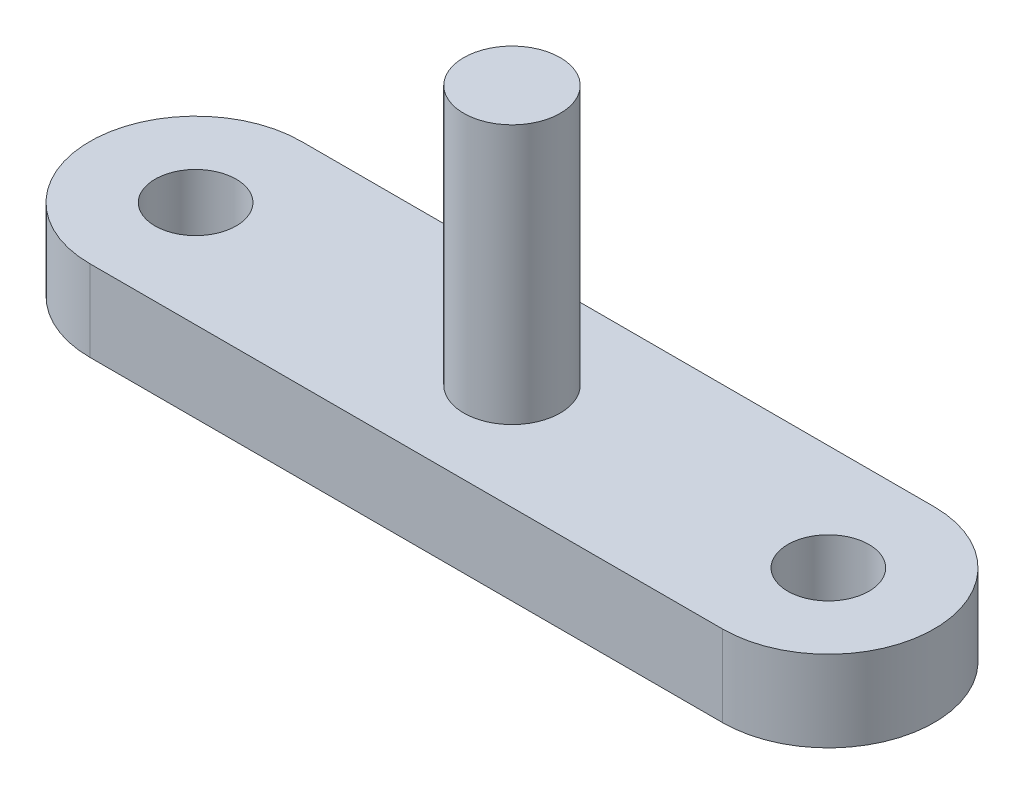
ISO-10303-21;
HEADER;
FILE_DESCRIPTION(('STEP AP214'),'2;1');
FILE_NAME('part.step','',(''),(''),'','','');
FILE_SCHEMA(('AUTOMOTIVE_DESIGN { 1 0 10303 214 1 1 1 1 }'));
ENDSEC;
DATA;
#1=APPLICATION_CONTEXT('core data for automotive mechanical design processes');
#2=APPLICATION_PROTOCOL_DEFINITION('international standard','automotive_design',2000,#1);
#3=PRODUCT_CONTEXT('',#1,'mechanical');
#4=PRODUCT('Part','Part','',(#3));
#5=PRODUCT_RELATED_PRODUCT_CATEGORY('part','',(#4));
#6=PRODUCT_DEFINITION_FORMATION('','',#4);
#7=PRODUCT_DEFINITION_CONTEXT('part definition',#1,'design');
#8=PRODUCT_DEFINITION('design','',#6,#7);
#9=PRODUCT_DEFINITION_SHAPE('','',#8);
#10=(LENGTH_UNIT() NAMED_UNIT(*) SI_UNIT(.MILLI.,.METRE.));
#11=(NAMED_UNIT(*) PLANE_ANGLE_UNIT() SI_UNIT($,.RADIAN.));
#12=(NAMED_UNIT(*) SI_UNIT($,.STERADIAN.) SOLID_ANGLE_UNIT());
#13=UNCERTAINTY_MEASURE_WITH_UNIT(LENGTH_MEASURE(1.E-05),#10,'distance_accuracy_value','');
#14=(GEOMETRIC_REPRESENTATION_CONTEXT(3) GLOBAL_UNCERTAINTY_ASSIGNED_CONTEXT((#13)) GLOBAL_UNIT_ASSIGNED_CONTEXT((#10,
#11,#12)) REPRESENTATION_CONTEXT('',''));
#15=CARTESIAN_POINT('',(0.,0.,0.));
#16=DIRECTION('',(0.,0.,1.));
#17=DIRECTION('',(1.,0.,0.));
#18=AXIS2_PLACEMENT_3D('',#15,#16,#17);
#19=CARTESIAN_POINT('',(0.,5.,6.52373761226954));
#20=DIRECTION('',(0.,0.,-1.));
#21=DIRECTION('',(-1.,0.,0.));
#22=AXIS2_PLACEMENT_3D('',#19,#20,#21);
#23=PLANE('',#22);
#24=DIRECTION('',(1.,0.,0.));
#25=VECTOR('',#24,1.);
#26=CARTESIAN_POINT('',(0.,0.,6.52373761226954));
#27=LINE('',#26,#25);
#28=CARTESIAN_POINT('',(-19.5,0.,6.52373761226954));
#29=VERTEX_POINT('',#28);
#30=CARTESIAN_POINT('',(19.5,0.,6.52373761226954));
#31=VERTEX_POINT('',#30);
#32=EDGE_CURVE('E114',#29,#31,#27,.T.);
#33=ORIENTED_EDGE('',*,*,#32,.T.);
#34=DIRECTION('',(0.,-1.,0.));
#35=VECTOR('',#34,1.);
#36=CARTESIAN_POINT('',(19.5,5.,6.52373761226954));
#37=LINE('',#36,#35);
#38=CARTESIAN_POINT('',(19.5,5.,6.52373761226954));
#39=VERTEX_POINT('',#38);
#40=EDGE_CURVE('E11',#39,#31,#37,.T.);
#41=ORIENTED_EDGE('',*,*,#40,.F.);
#42=DIRECTION('',(1.,0.,0.));
#43=VECTOR('',#42,1.);
#44=CARTESIAN_POINT('',(0.,5.,6.52373761226954));
#45=LINE('',#44,#43);
#46=CARTESIAN_POINT('',(-19.5,5.,6.52373761226954));
#47=VERTEX_POINT('',#46);
#48=EDGE_CURVE('E93',#47,#39,#45,.T.);
#49=ORIENTED_EDGE('',*,*,#48,.F.);
#50=DIRECTION('',(0.,-1.,0.));
#51=VECTOR('',#50,1.);
#52=CARTESIAN_POINT('',(-19.5,5.,6.52373761226954));
#53=LINE('',#52,#51);
#54=EDGE_CURVE('E105',#47,#29,#53,.T.);
#55=ORIENTED_EDGE('',*,*,#54,.T.);
#56=EDGE_LOOP('',(#33,#41,#49,#55));
#57=FACE_BOUND('',#56,.T.);
#58=ADVANCED_FACE('F43',(#57),#23,.F.);
#59=CARTESIAN_POINT('',(19.5,5.,0.));
#60=DIRECTION('',(0.,-1.,0.));
#61=DIRECTION('',(0.,0.,-1.));
#62=AXIS2_PLACEMENT_3D('',#59,#60,#61);
#63=CYLINDRICAL_SURFACE('',#62,6.52373761226954);
#64=CARTESIAN_POINT('',(19.5,0.,0.));
#65=DIRECTION('',(0.,1.,0.));
#66=DIRECTION('',(0.,0.,1.));
#67=AXIS2_PLACEMENT_3D('',#64,#65,#66);
#68=CIRCLE('',#67,6.52373761226954);
#69=CARTESIAN_POINT('',(19.5,0.,-6.52373761226954));
#70=VERTEX_POINT('',#69);
#71=EDGE_CURVE('E96',#31,#70,#68,.T.);
#72=ORIENTED_EDGE('',*,*,#71,.T.);
#73=DIRECTION('',(0.,-1.,0.));
#74=VECTOR('',#73,1.);
#75=CARTESIAN_POINT('',(19.5,5.,-6.52373761226954));
#76=LINE('',#75,#74);
#77=CARTESIAN_POINT('',(19.5,5.,-6.52373761226954));
#78=VERTEX_POINT('',#77);
#79=EDGE_CURVE('E55',#78,#70,#76,.T.);
#80=ORIENTED_EDGE('',*,*,#79,.F.);
#81=CARTESIAN_POINT('',(19.5,5.,0.));
#82=DIRECTION('',(0.,1.,0.));
#83=DIRECTION('',(0.,0.,1.));
#84=AXIS2_PLACEMENT_3D('',#81,#82,#83);
#85=CIRCLE('',#84,6.52373761226954);
#86=EDGE_CURVE('E88',#39,#78,#85,.T.);
#87=ORIENTED_EDGE('',*,*,#86,.F.);
#88=ORIENTED_EDGE('',*,*,#40,.T.);
#89=EDGE_LOOP('',(#72,#80,#87,#88));
#90=FACE_BOUND('',#89,.T.);
#91=ADVANCED_FACE('F92',(#90),#63,.T.);
#92=CARTESIAN_POINT('',(0.,5.,-6.52373761226954));
#93=DIRECTION('',(0.,0.,-1.));
#94=DIRECTION('',(-1.,0.,0.));
#95=AXIS2_PLACEMENT_3D('',#92,#93,#94);
#96=PLANE('',#95);
#97=DIRECTION('',(1.,0.,0.));
#98=VECTOR('',#97,1.);
#99=CARTESIAN_POINT('',(0.,0.,-6.52373761226954));
#100=LINE('',#99,#98);
#101=CARTESIAN_POINT('',(-19.5,0.,-6.52373761226954));
#102=VERTEX_POINT('',#101);
#103=EDGE_CURVE('E120',#102,#70,#100,.T.);
#104=ORIENTED_EDGE('',*,*,#103,.F.);
#105=DIRECTION('',(0.,-1.,0.));
#106=VECTOR('',#105,1.);
#107=CARTESIAN_POINT('',(-19.5,5.,-6.52373761226954));
#108=LINE('',#107,#106);
#109=CARTESIAN_POINT('',(-19.5,5.,-6.52373761226954));
#110=VERTEX_POINT('',#109);
#111=EDGE_CURVE('E77',#110,#102,#108,.T.);
#112=ORIENTED_EDGE('',*,*,#111,.F.);
#113=DIRECTION('',(1.,0.,0.));
#114=VECTOR('',#113,1.);
#115=CARTESIAN_POINT('',(0.,5.,-6.52373761226954));
#116=LINE('',#115,#114);
#117=EDGE_CURVE('E90',#110,#78,#116,.T.);
#118=ORIENTED_EDGE('',*,*,#117,.T.);
#119=ORIENTED_EDGE('',*,*,#79,.T.);
#120=EDGE_LOOP('',(#104,#112,#118,#119));
#121=FACE_BOUND('',#120,.T.);
#122=ADVANCED_FACE('F99',(#121),#96,.T.);
#123=CARTESIAN_POINT('',(-19.5,5.,0.));
#124=DIRECTION('',(0.,-1.,0.));
#125=DIRECTION('',(0.,0.,-1.));
#126=AXIS2_PLACEMENT_3D('',#123,#124,#125);
#127=CYLINDRICAL_SURFACE('',#126,2.5);
#128=CARTESIAN_POINT('',(-19.5,5.,0.));
#129=DIRECTION('',(0.,1.,0.));
#130=DIRECTION('',(0.,0.,1.));
#131=AXIS2_PLACEMENT_3D('',#128,#129,#130);
#132=CIRCLE('',#131,2.5);
#133=CARTESIAN_POINT('',(-19.5,5.,2.5));
#134=VERTEX_POINT('',#133);
#135=EDGE_CURVE('E159',#134,#134,#132,.T.);
#136=ORIENTED_EDGE('',*,*,#135,.T.);
#137=EDGE_LOOP('',(#136));
#138=FACE_BOUND('',#137,.T.);
#139=CARTESIAN_POINT('',(-19.5,0.,0.));
#140=DIRECTION('',(0.,1.,0.));
#141=DIRECTION('',(0.,0.,1.));
#142=AXIS2_PLACEMENT_3D('',#139,#140,#141);
#143=CIRCLE('',#142,2.5);
#144=CARTESIAN_POINT('',(-19.5,0.,2.5));
#145=VERTEX_POINT('',#144);
#146=EDGE_CURVE('E108',#145,#145,#143,.T.);
#147=ORIENTED_EDGE('',*,*,#146,.F.);
#148=EDGE_LOOP('',(#147));
#149=FACE_BOUND('',#148,.T.);
#150=ADVANCED_FACE('F149',(#138,#149),#127,.F.);
#151=CARTESIAN_POINT('',(19.5,5.,0.));
#152=DIRECTION('',(0.,-1.,0.));
#153=DIRECTION('',(0.,0.,-1.));
#154=AXIS2_PLACEMENT_3D('',#151,#152,#153);
#155=CYLINDRICAL_SURFACE('',#154,2.5);
#156=CARTESIAN_POINT('',(19.5,5.,0.));
#157=DIRECTION('',(0.,1.,0.));
#158=DIRECTION('',(0.,0.,1.));
#159=AXIS2_PLACEMENT_3D('',#156,#157,#158);
#160=CIRCLE('',#159,2.5);
#161=CARTESIAN_POINT('',(19.5,5.,2.5));
#162=VERTEX_POINT('',#161);
#163=EDGE_CURVE('E162',#162,#162,#160,.T.);
#164=ORIENTED_EDGE('',*,*,#163,.T.);
#165=EDGE_LOOP('',(#164));
#166=FACE_BOUND('',#165,.T.);
#167=CARTESIAN_POINT('',(19.5,0.,0.));
#168=DIRECTION('',(0.,1.,0.));
#169=DIRECTION('',(0.,0.,1.));
#170=AXIS2_PLACEMENT_3D('',#167,#168,#169);
#171=CIRCLE('',#170,2.5);
#172=CARTESIAN_POINT('',(19.5,0.,2.5));
#173=VERTEX_POINT('',#172);
#174=EDGE_CURVE('E106',#173,#173,#171,.T.);
#175=ORIENTED_EDGE('',*,*,#174,.F.);
#176=EDGE_LOOP('',(#175));
#177=FACE_BOUND('',#176,.T.);
#178=ADVANCED_FACE('F44',(#166,#177),#155,.F.);
#179=CARTESIAN_POINT('',(-19.5,5.,0.));
#180=DIRECTION('',(0.,-1.,0.));
#181=DIRECTION('',(0.,0.,-1.));
#182=AXIS2_PLACEMENT_3D('',#179,#180,#181);
#183=CYLINDRICAL_SURFACE('',#182,6.52373761226954);
#184=CARTESIAN_POINT('',(-19.5,0.,0.));
#185=DIRECTION('',(0.,1.,0.));
#186=DIRECTION('',(0.,0.,1.));
#187=AXIS2_PLACEMENT_3D('',#184,#185,#186);
#188=CIRCLE('',#187,6.52373761226954);
#189=EDGE_CURVE('E76',#102,#29,#188,.T.);
#190=ORIENTED_EDGE('',*,*,#189,.T.);
#191=ORIENTED_EDGE('',*,*,#54,.F.);
#192=CARTESIAN_POINT('',(-19.5,5.,0.));
#193=DIRECTION('',(0.,1.,0.));
#194=DIRECTION('',(0.,0.,1.));
#195=AXIS2_PLACEMENT_3D('',#192,#193,#194);
#196=CIRCLE('',#195,6.52373761226954);
#197=EDGE_CURVE('E58',#110,#47,#196,.T.);
#198=ORIENTED_EDGE('',*,*,#197,.F.);
#199=ORIENTED_EDGE('',*,*,#111,.T.);
#200=EDGE_LOOP('',(#190,#191,#198,#199));
#201=FACE_BOUND('',#200,.T.);
#202=ADVANCED_FACE('F140',(#201),#183,.T.);
#203=CARTESIAN_POINT('',(0.,5.,0.));
#204=DIRECTION('',(0.,1.,0.));
#205=DIRECTION('',(0.,0.,1.));
#206=AXIS2_PLACEMENT_3D('',#203,#204,#205);
#207=PLANE('',#206);
#208=CARTESIAN_POINT('',(0.,5.,0.));
#209=DIRECTION('',(0.,1.,0.));
#210=DIRECTION('',(0.,0.,1.));
#211=AXIS2_PLACEMENT_3D('',#208,#209,#210);
#212=CIRCLE('',#211,2.975);
#213=CARTESIAN_POINT('',(0.,5.,-2.975));
#214=VERTEX_POINT('',#213);
#215=EDGE_CURVE('E118',#214,#214,#212,.T.);
#216=ORIENTED_EDGE('',*,*,#215,.F.);
#217=EDGE_LOOP('',(#216));
#218=FACE_BOUND('',#217,.T.);
#219=ORIENTED_EDGE('',*,*,#163,.F.);
#220=EDGE_LOOP('',(#219));
#221=FACE_BOUND('',#220,.T.);
#222=ORIENTED_EDGE('',*,*,#135,.F.);
#223=EDGE_LOOP('',(#222));
#224=FACE_BOUND('',#223,.T.);
#225=ORIENTED_EDGE('',*,*,#48,.T.);
#226=ORIENTED_EDGE('',*,*,#86,.T.);
#227=ORIENTED_EDGE('',*,*,#117,.F.);
#228=ORIENTED_EDGE('',*,*,#197,.T.);
#229=EDGE_LOOP('',(#225,#226,#227,#228));
#230=FACE_BOUND('',#229,.T.);
#231=ADVANCED_FACE('F87',(#218,#221,#224,#230),#207,.T.);
#232=CARTESIAN_POINT('',(0.,0.,0.));
#233=DIRECTION('',(0.,1.,0.));
#234=DIRECTION('',(0.,0.,1.));
#235=AXIS2_PLACEMENT_3D('',#232,#233,#234);
#236=PLANE('',#235);
#237=ORIENTED_EDGE('',*,*,#174,.T.);
#238=EDGE_LOOP('',(#237));
#239=FACE_BOUND('',#238,.T.);
#240=ORIENTED_EDGE('',*,*,#146,.T.);
#241=EDGE_LOOP('',(#240));
#242=FACE_BOUND('',#241,.T.);
#243=ORIENTED_EDGE('',*,*,#32,.F.);
#244=ORIENTED_EDGE('',*,*,#189,.F.);
#245=ORIENTED_EDGE('',*,*,#103,.T.);
#246=ORIENTED_EDGE('',*,*,#71,.F.);
#247=EDGE_LOOP('',(#243,#244,#245,#246));
#248=FACE_BOUND('',#247,.T.);
#249=ADVANCED_FACE('F123',(#239,#242,#248),#236,.F.);
#250=CARTESIAN_POINT('',(0.,21.,0.));
#251=DIRECTION('',(0.,-1.,0.));
#252=DIRECTION('',(0.,0.,-1.));
#253=AXIS2_PLACEMENT_3D('',#250,#251,#252);
#254=CYLINDRICAL_SURFACE('',#253,2.975);
#255=CARTESIAN_POINT('',(0.,21.,0.));
#256=DIRECTION('',(0.,1.,0.));
#257=DIRECTION('',(0.,0.,1.));
#258=AXIS2_PLACEMENT_3D('',#255,#256,#257);
#259=CIRCLE('',#258,2.975);
#260=CARTESIAN_POINT('',(0.,21.,-2.975));
#261=VERTEX_POINT('',#260);
#262=EDGE_CURVE('E109',#261,#261,#259,.T.);
#263=CARTESIAN_POINT('',(0.,5.,-2.975));
#264=CARTESIAN_POINT('',(0.,5.16666666666666,-2.975));
#265=CARTESIAN_POINT('',(0.,5.33333333333333,-2.975));
#266=CARTESIAN_POINT('',(0.,5.66666666666666,-2.975));
#267=CARTESIAN_POINT('',(0.,5.83333333333333,-2.975));
#268=CARTESIAN_POINT('',(0.,6.16666666666666,-2.975));
#269=CARTESIAN_POINT('',(0.,6.33333333333333,-2.975));
#270=CARTESIAN_POINT('',(0.,6.66666666666666,-2.975));
#271=CARTESIAN_POINT('',(0.,6.83333333333333,-2.975));
#272=CARTESIAN_POINT('',(0.,7.16666666666666,-2.975));
#273=CARTESIAN_POINT('',(0.,7.33333333333333,-2.975));
#274=CARTESIAN_POINT('',(0.,7.66666666666666,-2.975));
#275=CARTESIAN_POINT('',(0.,7.83333333333333,-2.975));
#276=CARTESIAN_POINT('',(0.,8.16666666666666,-2.975));
#277=CARTESIAN_POINT('',(0.,8.33333333333333,-2.975));
#278=CARTESIAN_POINT('',(0.,8.66666666666666,-2.975));
#279=CARTESIAN_POINT('',(0.,8.83333333333333,-2.975));
#280=CARTESIAN_POINT('',(0.,9.16666666666666,-2.975));
#281=CARTESIAN_POINT('',(0.,9.33333333333333,-2.975));
#282=CARTESIAN_POINT('',(0.,9.66666666666667,-2.975));
#283=CARTESIAN_POINT('',(0.,9.83333333333333,-2.975));
#284=CARTESIAN_POINT('',(0.,10.1666666666667,-2.975));
#285=CARTESIAN_POINT('',(0.,10.3333333333333,-2.975));
#286=CARTESIAN_POINT('',(0.,10.6666666666667,-2.975));
#287=CARTESIAN_POINT('',(0.,10.8333333333333,-2.975));
#288=CARTESIAN_POINT('',(0.,11.1666666666667,-2.975));
#289=CARTESIAN_POINT('',(0.,11.3333333333333,-2.975));
#290=CARTESIAN_POINT('',(0.,11.6666666666667,-2.975));
#291=CARTESIAN_POINT('',(0.,11.8333333333333,-2.975));
#292=CARTESIAN_POINT('',(0.,12.1666666666667,-2.975));
#293=CARTESIAN_POINT('',(0.,12.3333333333333,-2.975));
#294=CARTESIAN_POINT('',(0.,12.6666666666667,-2.975));
#295=CARTESIAN_POINT('',(0.,12.8333333333333,-2.975));
#296=CARTESIAN_POINT('',(0.,13.1666666666667,-2.975));
#297=CARTESIAN_POINT('',(0.,13.3333333333333,-2.975));
#298=CARTESIAN_POINT('',(0.,13.6666666666667,-2.975));
#299=CARTESIAN_POINT('',(0.,13.8333333333333,-2.975));
#300=CARTESIAN_POINT('',(0.,14.1666666666667,-2.975));
#301=CARTESIAN_POINT('',(0.,14.3333333333333,-2.975));
#302=CARTESIAN_POINT('',(0.,14.6666666666667,-2.975));
#303=CARTESIAN_POINT('',(0.,14.8333333333333,-2.975));
#304=CARTESIAN_POINT('',(0.,15.1666666666667,-2.975));
#305=CARTESIAN_POINT('',(0.,15.3333333333333,-2.975));
#306=CARTESIAN_POINT('',(0.,15.6666666666667,-2.975));
#307=CARTESIAN_POINT('',(0.,15.8333333333333,-2.975));
#308=CARTESIAN_POINT('',(0.,16.1666666666667,-2.975));
#309=CARTESIAN_POINT('',(0.,16.3333333333333,-2.975));
#310=CARTESIAN_POINT('',(0.,16.6666666666667,-2.975));
#311=CARTESIAN_POINT('',(0.,16.8333333333333,-2.975));
#312=CARTESIAN_POINT('',(0.,17.1666666666667,-2.975));
#313=CARTESIAN_POINT('',(0.,17.3333333333333,-2.975));
#314=CARTESIAN_POINT('',(0.,17.6666666666667,-2.975));
#315=CARTESIAN_POINT('',(0.,17.8333333333333,-2.975));
#316=CARTESIAN_POINT('',(0.,18.1666666666667,-2.975));
#317=CARTESIAN_POINT('',(0.,18.3333333333333,-2.975));
#318=CARTESIAN_POINT('',(0.,18.6666666666667,-2.975));
#319=CARTESIAN_POINT('',(0.,18.8333333333333,-2.975));
#320=CARTESIAN_POINT('',(0.,19.1666666666667,-2.975));
#321=CARTESIAN_POINT('',(0.,19.3333333333333,-2.975));
#322=CARTESIAN_POINT('',(0.,19.6666666666667,-2.975));
#323=CARTESIAN_POINT('',(0.,19.8333333333333,-2.975));
#324=CARTESIAN_POINT('',(0.,20.1666666666667,-2.975));
#325=CARTESIAN_POINT('',(0.,20.3333333333333,-2.975));
#326=CARTESIAN_POINT('',(0.,20.6666666666667,-2.975));
#327=CARTESIAN_POINT('',(0.,20.8333333333333,-2.975));
#328=CARTESIAN_POINT('',(0.,21.,-2.975));
#329=B_SPLINE_CURVE_WITH_KNOTS('',3,(#263,#264,#265,#266,#267,#268,#269,#270,#271,#272,#273,
#274,#275,#276,#277,#278,#279,#280,#281,#282,#283,#284,#285,#286,#287,#288,#289,#290,#291,#292,
#293,#294,#295,#296,#297,#298,#299,#300,#301,#302,#303,#304,#305,#306,#307,#308,#309,#310,#311,
#312,#313,#314,#315,#316,#317,#318,#319,#320,#321,#322,#323,#324,#325,#326,#327,#328),
.UNSPECIFIED.,.F.,.F.,(4,2,2,2,2,2,2,2,2,2,2,2,2,2,2,2,2,2,2,2,2,2,2,2,2,2,2,2,2,2,2,2,4),(0.,
0.499999999999999,0.999999999999999,1.5,2.,2.5,3.,3.5,4.,4.5,5.,5.5,6.,6.5,7.,7.5,8.,8.5,9.,9.5,
10.,10.5,11.,11.5,12.,12.5,13.,13.5,14.,14.5,15.,15.5,16.),.UNSPECIFIED.);
#330=EDGE_CURVE('BSEAM130',#214,#261,#329,.T.);
#331=ORIENTED_EDGE('',*,*,#215,.T.);
#332=ORIENTED_EDGE('',*,*,#262,.F.);
#333=ORIENTED_EDGE('',*,*,#330,.T.);
#334=ORIENTED_EDGE('',*,*,#330,.F.);
#335=EDGE_LOOP('',(#331,#333,#332,#334));
#336=FACE_BOUND('',#335,.T.);
#337=ADVANCED_FACE('F130',(#336),#254,.T.);
#338=CARTESIAN_POINT('',(0.,21.,0.));
#339=DIRECTION('',(0.,1.,0.));
#340=DIRECTION('',(0.,0.,1.));
#341=AXIS2_PLACEMENT_3D('',#338,#339,#340);
#342=PLANE('',#341);
#343=ORIENTED_EDGE('',*,*,#262,.T.);
#344=EDGE_LOOP('',(#343));
#345=FACE_BOUND('',#344,.T.);
#346=ADVANCED_FACE('F131',(#345),#342,.T.);
#347=CLOSED_SHELL('',(#58,#91,#122,#150,#178,#202,#231,#249,#337,#346));
#348=MANIFOLD_SOLID_BREP('B2',#347);
#349=ADVANCED_BREP_SHAPE_REPRESENTATION('',(#18,#348),#14);
#350=SHAPE_DEFINITION_REPRESENTATION(#9,#349);
ENDSEC;
END-ISO-10303-21;
